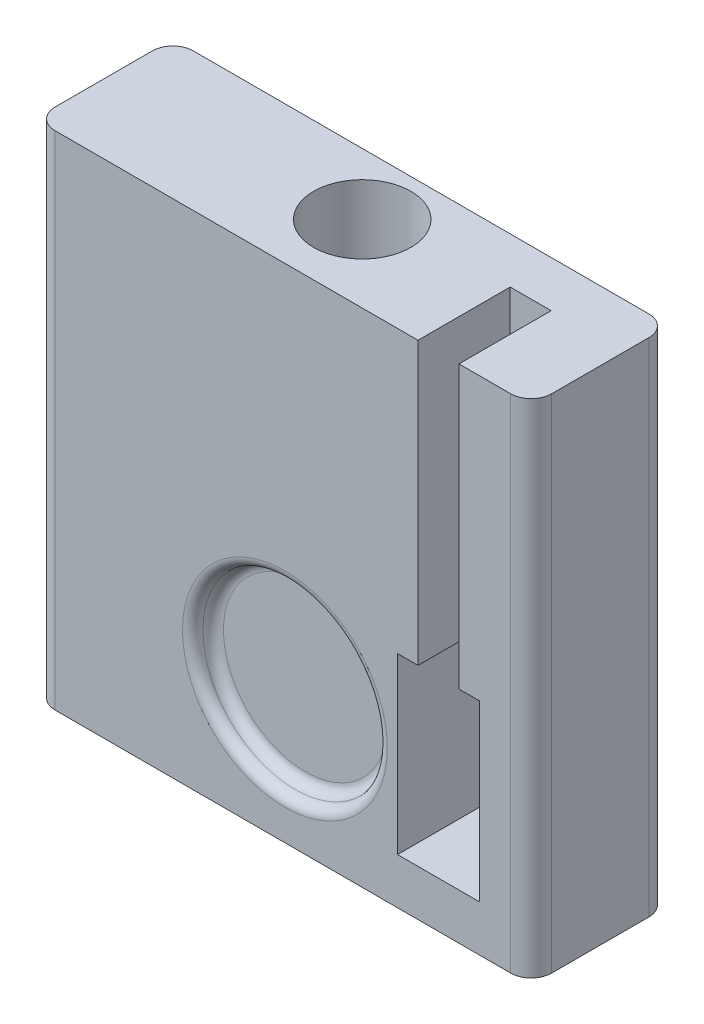
ISO-10303-21;
HEADER;
FILE_DESCRIPTION(('STEP AP214'),'2;1');
FILE_NAME('part.step','',(''),(''),'','','');
FILE_SCHEMA(('AUTOMOTIVE_DESIGN { 1 0 10303 214 1 1 1 1 }'));
ENDSEC;
DATA;
#1=APPLICATION_CONTEXT('core data for automotive mechanical design processes');
#2=APPLICATION_PROTOCOL_DEFINITION('international standard','automotive_design',2000,#1);
#3=PRODUCT_CONTEXT('',#1,'mechanical');
#4=PRODUCT('Part','Part','',(#3));
#5=PRODUCT_RELATED_PRODUCT_CATEGORY('part','',(#4));
#6=PRODUCT_DEFINITION_FORMATION('','',#4);
#7=PRODUCT_DEFINITION_CONTEXT('part definition',#1,'design');
#8=PRODUCT_DEFINITION('design','',#6,#7);
#9=PRODUCT_DEFINITION_SHAPE('','',#8);
#10=(LENGTH_UNIT() NAMED_UNIT(*) SI_UNIT(.MILLI.,.METRE.));
#11=(NAMED_UNIT(*) PLANE_ANGLE_UNIT() SI_UNIT($,.RADIAN.));
#12=(NAMED_UNIT(*) SI_UNIT($,.STERADIAN.) SOLID_ANGLE_UNIT());
#13=UNCERTAINTY_MEASURE_WITH_UNIT(LENGTH_MEASURE(1.E-05),#10,'distance_accuracy_value','');
#14=(GEOMETRIC_REPRESENTATION_CONTEXT(3) GLOBAL_UNCERTAINTY_ASSIGNED_CONTEXT((#13)) GLOBAL_UNIT_ASSIGNED_CONTEXT((#10,
#11,#12)) REPRESENTATION_CONTEXT('',''));
#15=CARTESIAN_POINT('',(0.,0.,0.));
#16=DIRECTION('',(0.,0.,1.));
#17=DIRECTION('',(1.,0.,0.));
#18=AXIS2_PLACEMENT_3D('',#15,#16,#17);
#19=CARTESIAN_POINT('',(0.,0.,-26.8410191337075));
#20=DIRECTION('',(0.,0.,1.));
#21=DIRECTION('',(1.,0.,0.));
#22=AXIS2_PLACEMENT_3D('',#19,#20,#21);
#23=PLANE('',#22);
#24=DIRECTION('',(-1.,0.,0.));
#25=VECTOR('',#24,1.);
#26=CARTESIAN_POINT('',(32.6433043612604,2.51671301439862,-26.8410191337075));
#27=LINE('',#26,#25);
#28=CARTESIAN_POINT('',(40.6433043612604,2.51671301439862,-26.8410191337075));
#29=VERTEX_POINT('',#28);
#30=CARTESIAN_POINT('',(32.6433043612604,2.51671301439862,-26.8410191337075));
#31=VERTEX_POINT('',#30);
#32=EDGE_CURVE('E200',#29,#31,#27,.T.);
#33=ORIENTED_EDGE('',*,*,#32,.T.);
#34=DIRECTION('',(0.,-1.,0.));
#35=VECTOR('',#34,1.);
#36=CARTESIAN_POINT('',(32.6433043612604,2.51671301439862,-26.8410191337075));
#37=LINE('',#36,#35);
#38=CARTESIAN_POINT('',(32.6433043612604,-14.4832869856014,-26.8410191337075));
#39=VERTEX_POINT('',#38);
#40=EDGE_CURVE('E190',#31,#39,#37,.T.);
#41=ORIENTED_EDGE('',*,*,#40,.T.);
#42=DIRECTION('',(1.,0.,0.));
#43=VECTOR('',#42,1.);
#44=CARTESIAN_POINT('',(32.6433043612604,-14.4832869856014,-26.8410191337075));
#45=LINE('',#44,#43);
#46=CARTESIAN_POINT('',(40.6433043612604,-14.4832869856014,-26.8410191337075));
#47=VERTEX_POINT('',#46);
#48=EDGE_CURVE('E193',#39,#47,#45,.T.);
#49=ORIENTED_EDGE('',*,*,#48,.T.);
#50=DIRECTION('',(0.,1.,0.));
#51=VECTOR('',#50,1.);
#52=CARTESIAN_POINT('',(40.6433043612604,2.51671301439862,-26.8410191337075));
#53=LINE('',#52,#51);
#54=EDGE_CURVE('E197',#47,#29,#53,.T.);
#55=ORIENTED_EDGE('',*,*,#54,.T.);
#56=EDGE_LOOP('',(#33,#41,#49,#55));
#57=FACE_BOUND('',#56,.T.);
#58=ADVANCED_FACE('F36',(#57),#23,.T.);
#59=CARTESIAN_POINT('',(43.696678655462,-69.3290720526958,-16.8410191337075));
#60=DIRECTION('',(0.,0.,-1.));
#61=DIRECTION('',(-1.,0.,0.));
#62=AXIS2_PLACEMENT_3D('',#59,#60,#61);
#63=PLANE('',#62);
#64=CARTESIAN_POINT('',(21.6433043612604,-5.98328698560138,-16.8410191337075));
#65=DIRECTION('',(0.,0.,-1.));
#66=DIRECTION('',(-1.,0.,0.));
#67=AXIS2_PLACEMENT_3D('',#64,#65,#66);
#68=CIRCLE('',#67,10.);
#69=CARTESIAN_POINT('',(11.6433043612604,-5.98328698560138,-16.8410191337075));
#70=VERTEX_POINT('',#69);
#71=EDGE_CURVE('E45',#70,#70,#68,.T.);
#72=ORIENTED_EDGE('',*,*,#71,.T.);
#73=EDGE_LOOP('',(#72));
#74=FACE_BOUND('',#73,.T.);
#75=DIRECTION('',(0.,1.,0.));
#76=VECTOR('',#75,1.);
#77=CARTESIAN_POINT('',(38.6433043612604,-7.98525416012828,-16.8410191337075));
#78=LINE('',#77,#76);
#79=CARTESIAN_POINT('',(38.6433043612604,2.51671301439862,-16.8410191337075));
#80=VERTEX_POINT('',#79);
#81=CARTESIAN_POINT('',(38.6433043612604,30.0147458398717,-16.8410191337075));
#82=VERTEX_POINT('',#81);
#83=EDGE_CURVE('E173',#80,#82,#78,.T.);
#84=ORIENTED_EDGE('',*,*,#83,.F.);
#85=DIRECTION('',(-1.,0.,0.));
#86=VECTOR('',#85,1.);
#87=CARTESIAN_POINT('',(32.6433043612604,2.51671301439862,-16.8410191337075));
#88=LINE('',#87,#86);
#89=CARTESIAN_POINT('',(40.6433043612604,2.51671301439862,-16.8410191337075));
#90=VERTEX_POINT('',#89);
#91=EDGE_CURVE('E194',#90,#80,#88,.T.);
#92=ORIENTED_EDGE('',*,*,#91,.F.);
#93=DIRECTION('',(0.,1.,0.));
#94=VECTOR('',#93,1.);
#95=CARTESIAN_POINT('',(40.6433043612604,2.51671301439862,-16.8410191337075));
#96=LINE('',#95,#94);
#97=CARTESIAN_POINT('',(40.6433043612604,-14.4832869856014,-16.8410191337075));
#98=VERTEX_POINT('',#97);
#99=EDGE_CURVE('E207',#98,#90,#96,.T.);
#100=ORIENTED_EDGE('',*,*,#99,.F.);
#101=DIRECTION('',(1.,0.,0.));
#102=VECTOR('',#101,1.);
#103=CARTESIAN_POINT('',(32.6433043612604,-14.4832869856014,-16.8410191337075));
#104=LINE('',#103,#102);
#105=CARTESIAN_POINT('',(32.6433043612604,-14.4832869856014,-16.8410191337075));
#106=VERTEX_POINT('',#105);
#107=EDGE_CURVE('E204',#106,#98,#104,.T.);
#108=ORIENTED_EDGE('',*,*,#107,.F.);
#109=DIRECTION('',(0.,-1.,0.));
#110=VECTOR('',#109,1.);
#111=CARTESIAN_POINT('',(32.6433043612604,2.51671301439862,-16.8410191337075));
#112=LINE('',#111,#110);
#113=CARTESIAN_POINT('',(32.6433043612604,2.51671301439862,-16.8410191337075));
#114=VERTEX_POINT('',#113);
#115=EDGE_CURVE('E60',#114,#106,#112,.T.);
#116=ORIENTED_EDGE('',*,*,#115,.F.);
#117=CARTESIAN_POINT('',(34.6433043612604,2.51671301439862,-16.8410191337075));
#118=VERTEX_POINT('',#117);
#119=EDGE_CURVE('E210',#118,#114,#88,.T.);
#120=ORIENTED_EDGE('',*,*,#119,.F.);
#121=DIRECTION('',(0.,1.,0.));
#122=VECTOR('',#121,1.);
#123=CARTESIAN_POINT('',(34.6433043612604,-7.98525416012828,-16.8410191337075));
#124=LINE('',#123,#122);
#125=CARTESIAN_POINT('',(34.6433043612604,30.0147458398717,-16.8410191337075));
#126=VERTEX_POINT('',#125);
#127=EDGE_CURVE('E170',#118,#126,#124,.T.);
#128=ORIENTED_EDGE('',*,*,#127,.T.);
#129=DIRECTION('',(-1.,0.,0.));
#130=VECTOR('',#129,1.);
#131=CARTESIAN_POINT('',(43.696678655462,30.0147458398717,-16.8410191337075));
#132=LINE('',#131,#130);
#133=CARTESIAN_POINT('',(-0.803321344537979,30.0147458398717,-16.8410191337075));
#134=VERTEX_POINT('',#133);
#135=EDGE_CURVE('E169',#126,#134,#132,.T.);
#136=ORIENTED_EDGE('',*,*,#135,.T.);
#137=DIRECTION('',(0.,1.,0.));
#138=VECTOR('',#137,1.);
#139=CARTESIAN_POINT('',(-0.803321344537979,-69.3290720526958,-16.8410191337075));
#140=LINE('',#139,#138);
#141=CARTESIAN_POINT('',(-0.803321344537979,-18.9852541601283,-16.8410191337075));
#142=VERTEX_POINT('',#141);
#143=EDGE_CURVE('E245',#142,#134,#140,.T.);
#144=ORIENTED_EDGE('',*,*,#143,.F.);
#145=DIRECTION('',(-1.,0.,0.));
#146=VECTOR('',#145,1.);
#147=CARTESIAN_POINT('',(43.696678655462,-18.9852541601283,-16.8410191337075));
#148=LINE('',#147,#146);
#149=CARTESIAN_POINT('',(43.696678655462,-18.9852541601283,-16.8410191337075));
#150=VERTEX_POINT('',#149);
#151=EDGE_CURVE('E268',#150,#142,#148,.T.);
#152=ORIENTED_EDGE('',*,*,#151,.F.);
#153=DIRECTION('',(0.,1.,0.));
#154=VECTOR('',#153,1.);
#155=CARTESIAN_POINT('',(43.696678655462,-69.3290720526958,-16.8410191337075));
#156=LINE('',#155,#154);
#157=CARTESIAN_POINT('',(43.696678655462,30.0147458398717,-16.8410191337075));
#158=VERTEX_POINT('',#157);
#159=EDGE_CURVE('E252',#150,#158,#156,.T.);
#160=ORIENTED_EDGE('',*,*,#159,.T.);
#161=EDGE_CURVE('E246',#158,#82,#132,.T.);
#162=ORIENTED_EDGE('',*,*,#161,.T.);
#163=EDGE_LOOP('',(#84,#92,#100,#108,#116,#120,#128,#136,#144,#152,#160,#162));
#164=FACE_BOUND('',#163,.T.);
#165=ADVANCED_FACE('F288',(#74,#164),#63,.F.);
#166=CARTESIAN_POINT('',(43.696678655462,30.0147458398717,-18.8410191337075));
#167=DIRECTION('',(0.,-1.,0.));
#168=DIRECTION('',(0.,0.,-1.));
#169=AXIS2_PLACEMENT_3D('',#166,#167,#168);
#170=PLANE('',#169);
#171=DIRECTION('',(1.,0.,0.));
#172=VECTOR('',#171,1.);
#173=CARTESIAN_POINT('',(34.6433043612604,30.0147458398717,-25.8410191337075));
#174=LINE('',#173,#172);
#175=CARTESIAN_POINT('',(34.6433043612604,30.0147458398717,-25.8410191337075));
#176=VERTEX_POINT('',#175);
#177=CARTESIAN_POINT('',(38.6433043612604,30.0147458398717,-25.8410191337075));
#178=VERTEX_POINT('',#177);
#179=EDGE_CURVE('E149',#176,#178,#174,.T.);
#180=ORIENTED_EDGE('',*,*,#179,.T.);
#181=DIRECTION('',(0.,0.,1.));
#182=VECTOR('',#181,1.);
#183=CARTESIAN_POINT('',(38.6433043612604,30.0147458398717,0.));
#184=LINE('',#183,#182);
#185=EDGE_CURVE('E171',#178,#82,#184,.T.);
#186=ORIENTED_EDGE('',*,*,#185,.T.);
#187=ORIENTED_EDGE('',*,*,#161,.F.);
#188=CARTESIAN_POINT('',(43.696678655462,30.0147458398717,-18.8410191337075));
#189=DIRECTION('',(0.,-1.,0.));
#190=DIRECTION('',(0.,0.,-1.));
#191=AXIS2_PLACEMENT_3D('',#188,#189,#190);
#192=CIRCLE('',#191,2.);
#193=CARTESIAN_POINT('',(45.696678655462,30.0147458398717,-18.8410191337075));
#194=VERTEX_POINT('',#193);
#195=EDGE_CURVE('E249',#194,#158,#192,.T.);
#196=ORIENTED_EDGE('',*,*,#195,.F.);
#197=DIRECTION('',(0.,0.,1.));
#198=VECTOR('',#197,1.);
#199=CARTESIAN_POINT('',(45.696678655462,30.0147458398717,-28.3410191337075));
#200=LINE('',#199,#198);
#201=CARTESIAN_POINT('',(45.696678655462,30.0147458398717,-28.3410191337075));
#202=VERTEX_POINT('',#201);
#203=EDGE_CURVE('E221',#202,#194,#200,.T.);
#204=ORIENTED_EDGE('',*,*,#203,.F.);
#205=CARTESIAN_POINT('',(43.696678655462,30.0147458398717,-28.3410191337075));
#206=DIRECTION('',(0.,-1.,0.));
#207=DIRECTION('',(0.,0.,-1.));
#208=AXIS2_PLACEMENT_3D('',#205,#206,#207);
#209=CIRCLE('',#208,2.);
#210=CARTESIAN_POINT('',(43.696678655462,30.0147458398717,-30.3410191337075));
#211=VERTEX_POINT('',#210);
#212=EDGE_CURVE('E226',#211,#202,#209,.T.);
#213=ORIENTED_EDGE('',*,*,#212,.F.);
#214=DIRECTION('',(1.,0.,0.));
#215=VECTOR('',#214,1.);
#216=CARTESIAN_POINT('',(-0.803321344537978,30.0147458398717,-30.3410191337075));
#217=LINE('',#216,#215);
#218=CARTESIAN_POINT('',(-0.803321344537978,30.0147458398717,-30.3410191337075));
#219=VERTEX_POINT('',#218);
#220=EDGE_CURVE('E230',#219,#211,#217,.T.);
#221=ORIENTED_EDGE('',*,*,#220,.F.);
#222=CARTESIAN_POINT('',(-0.803321344537978,30.0147458398717,-28.3410191337075));
#223=DIRECTION('',(0.,-1.,0.));
#224=DIRECTION('',(0.,0.,-1.));
#225=AXIS2_PLACEMENT_3D('',#222,#223,#224);
#226=CIRCLE('',#225,2.);
#227=CARTESIAN_POINT('',(-2.80332134453798,30.0147458398717,-28.3410191337075));
#228=VERTEX_POINT('',#227);
#229=EDGE_CURVE('E234',#228,#219,#226,.T.);
#230=ORIENTED_EDGE('',*,*,#229,.F.);
#231=DIRECTION('',(0.,0.,-1.));
#232=VECTOR('',#231,1.);
#233=CARTESIAN_POINT('',(-2.80332134453798,30.0147458398717,-18.8410191337075));
#234=LINE('',#233,#232);
#235=CARTESIAN_POINT('',(-2.80332134453798,30.0147458398717,-18.8410191337075));
#236=VERTEX_POINT('',#235);
#237=EDGE_CURVE('E238',#236,#228,#234,.T.);
#238=ORIENTED_EDGE('',*,*,#237,.F.);
#239=CARTESIAN_POINT('',(-0.803321344537979,30.0147458398717,-18.8410191337075));
#240=DIRECTION('',(0.,-1.,0.));
#241=DIRECTION('',(0.,0.,-1.));
#242=AXIS2_PLACEMENT_3D('',#239,#240,#241);
#243=CIRCLE('',#242,2.);
#244=EDGE_CURVE('E242',#134,#236,#243,.T.);
#245=ORIENTED_EDGE('',*,*,#244,.F.);
#246=ORIENTED_EDGE('',*,*,#135,.F.);
#247=DIRECTION('',(0.,0.,1.));
#248=VECTOR('',#247,1.);
#249=CARTESIAN_POINT('',(34.6433043612604,30.0147458398717,0.));
#250=LINE('',#249,#248);
#251=EDGE_CURVE('E161',#176,#126,#250,.T.);
#252=ORIENTED_EDGE('',*,*,#251,.F.);
#253=EDGE_LOOP('',(#180,#186,#187,#196,#204,#213,#221,#230,#238,#245,#246,#252));
#254=FACE_BOUND('',#253,.T.);
#255=CARTESIAN_POINT('',(21.696678655462,30.0147458398717,-24.3410191337075));
#256=DIRECTION('',(0.,1.,0.));
#257=DIRECTION('',(0.,0.,1.));
#258=AXIS2_PLACEMENT_3D('',#255,#256,#257);
#259=CIRCLE('',#258,4.75);
#260=CARTESIAN_POINT('',(21.696678655462,30.0147458398717,-19.5910191337075));
#261=VERTEX_POINT('',#260);
#262=EDGE_CURVE('E184',#261,#261,#259,.T.);
#263=ORIENTED_EDGE('',*,*,#262,.F.);
#264=EDGE_LOOP('',(#263));
#265=FACE_BOUND('',#264,.T.);
#266=ADVANCED_FACE('F166',(#254,#265),#170,.F.);
#267=CARTESIAN_POINT('',(43.696678655462,-69.3290720526958,-18.8410191337075));
#268=DIRECTION('',(0.,1.,0.));
#269=DIRECTION('',(0.,0.,1.));
#270=AXIS2_PLACEMENT_3D('',#267,#268,#269);
#271=CYLINDRICAL_SURFACE('',#270,2.);
#272=CARTESIAN_POINT('',(43.696678655462,-18.9852541601283,-18.8410191337075));
#273=DIRECTION('',(0.,-1.,0.));
#274=DIRECTION('',(0.,0.,-1.));
#275=AXIS2_PLACEMENT_3D('',#272,#273,#274);
#276=CIRCLE('',#275,2.);
#277=CARTESIAN_POINT('',(45.696678655462,-18.9852541601283,-18.8410191337075));
#278=VERTEX_POINT('',#277);
#279=EDGE_CURVE('E271',#278,#150,#276,.T.);
#280=ORIENTED_EDGE('',*,*,#279,.F.);
#281=DIRECTION('',(0.,1.,0.));
#282=VECTOR('',#281,1.);
#283=CARTESIAN_POINT('',(45.696678655462,-69.3290720526958,-18.8410191337075));
#284=LINE('',#283,#282);
#285=EDGE_CURVE('E215',#278,#194,#284,.T.);
#286=ORIENTED_EDGE('',*,*,#285,.T.);
#287=ORIENTED_EDGE('',*,*,#195,.T.);
#288=ORIENTED_EDGE('',*,*,#159,.F.);
#289=EDGE_LOOP('',(#280,#286,#287,#288));
#290=FACE_BOUND('',#289,.T.);
#291=ADVANCED_FACE('F334',(#290),#271,.T.);
#292=CARTESIAN_POINT('',(-0.803321344537979,-69.3290720526958,-18.8410191337075));
#293=DIRECTION('',(0.,1.,0.));
#294=DIRECTION('',(0.,0.,1.));
#295=AXIS2_PLACEMENT_3D('',#292,#293,#294);
#296=CYLINDRICAL_SURFACE('',#295,2.);
#297=CARTESIAN_POINT('',(-0.803321344537979,-18.9852541601283,-18.8410191337075));
#298=DIRECTION('',(0.,-1.,0.));
#299=DIRECTION('',(0.,0.,-1.));
#300=AXIS2_PLACEMENT_3D('',#297,#298,#299);
#301=CIRCLE('',#300,2.);
#302=CARTESIAN_POINT('',(-2.80332134453798,-18.9852541601283,-18.8410191337075));
#303=VERTEX_POINT('',#302);
#304=EDGE_CURVE('E265',#142,#303,#301,.T.);
#305=ORIENTED_EDGE('',*,*,#304,.F.);
#306=ORIENTED_EDGE('',*,*,#143,.T.);
#307=ORIENTED_EDGE('',*,*,#244,.T.);
#308=DIRECTION('',(0.,1.,0.));
#309=VECTOR('',#308,1.);
#310=CARTESIAN_POINT('',(-2.80332134453798,-69.3290720526958,-18.8410191337075));
#311=LINE('',#310,#309);
#312=EDGE_CURVE('E241',#303,#236,#311,.T.);
#313=ORIENTED_EDGE('',*,*,#312,.F.);
#314=EDGE_LOOP('',(#305,#306,#307,#313));
#315=FACE_BOUND('',#314,.T.);
#316=ADVANCED_FACE('F354',(#315),#296,.T.);
#317=CARTESIAN_POINT('',(-2.80332134453798,-69.3290720526958,-18.8410191337075));
#318=DIRECTION('',(1.,0.,0.));
#319=DIRECTION('',(0.,0.,-1.));
#320=AXIS2_PLACEMENT_3D('',#317,#318,#319);
#321=PLANE('',#320);
#322=DIRECTION('',(0.,0.,-1.));
#323=VECTOR('',#322,1.);
#324=CARTESIAN_POINT('',(-2.80332134453798,-18.9852541601283,-18.8410191337075));
#325=LINE('',#324,#323);
#326=CARTESIAN_POINT('',(-2.80332134453798,-18.9852541601283,-28.3410191337075));
#327=VERTEX_POINT('',#326);
#328=EDGE_CURVE('E262',#303,#327,#325,.T.);
#329=ORIENTED_EDGE('',*,*,#328,.F.);
#330=ORIENTED_EDGE('',*,*,#312,.T.);
#331=ORIENTED_EDGE('',*,*,#237,.T.);
#332=DIRECTION('',(0.,1.,0.));
#333=VECTOR('',#332,1.);
#334=CARTESIAN_POINT('',(-2.80332134453798,-69.3290720526958,-28.3410191337075));
#335=LINE('',#334,#333);
#336=EDGE_CURVE('E237',#327,#228,#335,.T.);
#337=ORIENTED_EDGE('',*,*,#336,.F.);
#338=EDGE_LOOP('',(#329,#330,#331,#337));
#339=FACE_BOUND('',#338,.T.);
#340=ADVANCED_FACE('F350',(#339),#321,.F.);
#341=CARTESIAN_POINT('',(-0.803321344537978,-69.3290720526958,-28.3410191337075));
#342=DIRECTION('',(0.,1.,0.));
#343=DIRECTION('',(0.,0.,1.));
#344=AXIS2_PLACEMENT_3D('',#341,#342,#343);
#345=CYLINDRICAL_SURFACE('',#344,2.);
#346=CARTESIAN_POINT('',(-0.803321344537978,-18.9852541601283,-28.3410191337075));
#347=DIRECTION('',(0.,-1.,0.));
#348=DIRECTION('',(0.,0.,-1.));
#349=AXIS2_PLACEMENT_3D('',#346,#347,#348);
#350=CIRCLE('',#349,2.);
#351=CARTESIAN_POINT('',(-0.803321344537978,-18.9852541601283,-30.3410191337075));
#352=VERTEX_POINT('',#351);
#353=EDGE_CURVE('E259',#327,#352,#350,.T.);
#354=ORIENTED_EDGE('',*,*,#353,.F.);
#355=ORIENTED_EDGE('',*,*,#336,.T.);
#356=ORIENTED_EDGE('',*,*,#229,.T.);
#357=DIRECTION('',(0.,1.,0.));
#358=VECTOR('',#357,1.);
#359=CARTESIAN_POINT('',(-0.803321344537978,-69.3290720526958,-30.3410191337075));
#360=LINE('',#359,#358);
#361=EDGE_CURVE('E233',#352,#219,#360,.T.);
#362=ORIENTED_EDGE('',*,*,#361,.F.);
#363=EDGE_LOOP('',(#354,#355,#356,#362));
#364=FACE_BOUND('',#363,.T.);
#365=ADVANCED_FACE('F346',(#364),#345,.T.);
#366=CARTESIAN_POINT('',(-0.803321344537978,-69.3290720526958,-30.3410191337075));
#367=DIRECTION('',(0.,0.,1.));
#368=DIRECTION('',(1.,0.,0.));
#369=AXIS2_PLACEMENT_3D('',#366,#367,#368);
#370=PLANE('',#369);
#371=DIRECTION('',(1.,0.,0.));
#372=VECTOR('',#371,1.);
#373=CARTESIAN_POINT('',(-0.803321344537978,-18.9852541601283,-30.3410191337075));
#374=LINE('',#373,#372);
#375=CARTESIAN_POINT('',(43.696678655462,-18.9852541601283,-30.3410191337075));
#376=VERTEX_POINT('',#375);
#377=EDGE_CURVE('E256',#352,#376,#374,.T.);
#378=ORIENTED_EDGE('',*,*,#377,.F.);
#379=ORIENTED_EDGE('',*,*,#361,.T.);
#380=ORIENTED_EDGE('',*,*,#220,.T.);
#381=DIRECTION('',(0.,1.,0.));
#382=VECTOR('',#381,1.);
#383=CARTESIAN_POINT('',(43.696678655462,-69.3290720526958,-30.3410191337075));
#384=LINE('',#383,#382);
#385=EDGE_CURVE('E229',#376,#211,#384,.T.);
#386=ORIENTED_EDGE('',*,*,#385,.F.);
#387=EDGE_LOOP('',(#378,#379,#380,#386));
#388=FACE_BOUND('',#387,.T.);
#389=ADVANCED_FACE('F342',(#388),#370,.F.);
#390=CARTESIAN_POINT('',(43.696678655462,-69.3290720526958,-28.3410191337075));
#391=DIRECTION('',(0.,1.,0.));
#392=DIRECTION('',(0.,0.,1.));
#393=AXIS2_PLACEMENT_3D('',#390,#391,#392);
#394=CYLINDRICAL_SURFACE('',#393,2.);
#395=CARTESIAN_POINT('',(43.696678655462,-18.9852541601283,-28.3410191337075));
#396=DIRECTION('',(0.,-1.,0.));
#397=DIRECTION('',(0.,0.,-1.));
#398=AXIS2_PLACEMENT_3D('',#395,#396,#397);
#399=CIRCLE('',#398,2.);
#400=CARTESIAN_POINT('',(45.696678655462,-18.9852541601283,-28.3410191337075));
#401=VERTEX_POINT('',#400);
#402=EDGE_CURVE('E253',#376,#401,#399,.T.);
#403=ORIENTED_EDGE('',*,*,#402,.F.);
#404=ORIENTED_EDGE('',*,*,#385,.T.);
#405=ORIENTED_EDGE('',*,*,#212,.T.);
#406=DIRECTION('',(0.,1.,0.));
#407=VECTOR('',#406,1.);
#408=CARTESIAN_POINT('',(45.696678655462,-69.3290720526958,-28.3410191337075));
#409=LINE('',#408,#407);
#410=EDGE_CURVE('E225',#401,#202,#409,.T.);
#411=ORIENTED_EDGE('',*,*,#410,.F.);
#412=EDGE_LOOP('',(#403,#404,#405,#411));
#413=FACE_BOUND('',#412,.T.);
#414=ADVANCED_FACE('F338',(#413),#394,.T.);
#415=CARTESIAN_POINT('',(45.696678655462,-69.3290720526958,-28.3410191337075));
#416=DIRECTION('',(-1.,0.,0.));
#417=DIRECTION('',(0.,0.,1.));
#418=AXIS2_PLACEMENT_3D('',#415,#416,#417);
#419=PLANE('',#418);
#420=DIRECTION('',(0.,0.,1.));
#421=VECTOR('',#420,1.);
#422=CARTESIAN_POINT('',(45.696678655462,-18.9852541601283,-28.3410191337075));
#423=LINE('',#422,#421);
#424=EDGE_CURVE('E224',#401,#278,#423,.T.);
#425=ORIENTED_EDGE('',*,*,#424,.F.);
#426=ORIENTED_EDGE('',*,*,#410,.T.);
#427=ORIENTED_EDGE('',*,*,#203,.T.);
#428=ORIENTED_EDGE('',*,*,#285,.F.);
#429=EDGE_LOOP('',(#425,#426,#427,#428));
#430=FACE_BOUND('',#429,.T.);
#431=ADVANCED_FACE('F335',(#430),#419,.F.);
#432=CARTESIAN_POINT('',(46.696678655462,-18.9852541601283,-49.8410191337075));
#433=DIRECTION('',(0.,-1.,0.));
#434=DIRECTION('',(0.,0.,-1.));
#435=AXIS2_PLACEMENT_3D('',#432,#433,#434);
#436=PLANE('',#435);
#437=ORIENTED_EDGE('',*,*,#424,.T.);
#438=ORIENTED_EDGE('',*,*,#279,.T.);
#439=ORIENTED_EDGE('',*,*,#151,.T.);
#440=ORIENTED_EDGE('',*,*,#304,.T.);
#441=ORIENTED_EDGE('',*,*,#328,.T.);
#442=ORIENTED_EDGE('',*,*,#353,.T.);
#443=ORIENTED_EDGE('',*,*,#377,.T.);
#444=ORIENTED_EDGE('',*,*,#402,.T.);
#445=EDGE_LOOP('',(#437,#438,#439,#440,#441,#442,#443,#444));
#446=FACE_BOUND('',#445,.T.);
#447=ADVANCED_FACE('F331',(#446),#436,.T.);
#448=CARTESIAN_POINT('',(32.6433043612604,2.51671301439862,-26.8410191337075));
#449=DIRECTION('',(-1.,0.,0.));
#450=DIRECTION('',(0.,0.,1.));
#451=AXIS2_PLACEMENT_3D('',#448,#449,#450);
#452=PLANE('',#451);
#453=ORIENTED_EDGE('',*,*,#115,.T.);
#454=DIRECTION('',(0.,0.,1.));
#455=VECTOR('',#454,1.);
#456=CARTESIAN_POINT('',(32.6433043612604,-14.4832869856014,-26.8410191337075));
#457=LINE('',#456,#455);
#458=EDGE_CURVE('E202',#39,#106,#457,.T.);
#459=ORIENTED_EDGE('',*,*,#458,.F.);
#460=ORIENTED_EDGE('',*,*,#40,.F.);
#461=DIRECTION('',(0.,0.,1.));
#462=VECTOR('',#461,1.);
#463=CARTESIAN_POINT('',(32.6433043612604,2.51671301439862,-26.8410191337075));
#464=LINE('',#463,#462);
#465=EDGE_CURVE('E213',#31,#114,#464,.T.);
#466=ORIENTED_EDGE('',*,*,#465,.T.);
#467=EDGE_LOOP('',(#453,#459,#460,#466));
#468=FACE_BOUND('',#467,.T.);
#469=ADVANCED_FACE('F321',(#468),#452,.F.);
#470=CARTESIAN_POINT('',(32.6433043612604,2.51671301439862,-26.8410191337075));
#471=DIRECTION('',(0.,1.,0.));
#472=DIRECTION('',(0.,0.,1.));
#473=AXIS2_PLACEMENT_3D('',#470,#471,#472);
#474=PLANE('',#473);
#475=ORIENTED_EDGE('',*,*,#465,.F.);
#476=ORIENTED_EDGE('',*,*,#32,.F.);
#477=DIRECTION('',(0.,0.,1.));
#478=VECTOR('',#477,1.);
#479=CARTESIAN_POINT('',(40.6433043612604,2.51671301439862,-26.8410191337075));
#480=LINE('',#479,#478);
#481=EDGE_CURVE('E216',#29,#90,#480,.T.);
#482=ORIENTED_EDGE('',*,*,#481,.T.);
#483=ORIENTED_EDGE('',*,*,#91,.T.);
#484=DIRECTION('',(0.,0.,1.));
#485=VECTOR('',#484,1.);
#486=CARTESIAN_POINT('',(38.6433043612604,2.51671301439862,-26.8410191337075));
#487=LINE('',#486,#485);
#488=CARTESIAN_POINT('',(38.6433043612604,2.51671301439862,-25.8410191337075));
#489=VERTEX_POINT('',#488);
#490=EDGE_CURVE('E182',#489,#80,#487,.T.);
#491=ORIENTED_EDGE('',*,*,#490,.F.);
#492=DIRECTION('',(-1.,0.,0.));
#493=VECTOR('',#492,1.);
#494=CARTESIAN_POINT('',(34.6433043612604,2.51671301439862,-25.8410191337075));
#495=LINE('',#494,#493);
#496=CARTESIAN_POINT('',(34.6433043612604,2.51671301439862,-25.8410191337075));
#497=VERTEX_POINT('',#496);
#498=EDGE_CURVE('E175',#489,#497,#495,.T.);
#499=ORIENTED_EDGE('',*,*,#498,.T.);
#500=DIRECTION('',(0.,0.,1.));
#501=VECTOR('',#500,1.);
#502=CARTESIAN_POINT('',(34.6433043612604,2.51671301439862,-26.8410191337075));
#503=LINE('',#502,#501);
#504=EDGE_CURVE('E163',#497,#118,#503,.T.);
#505=ORIENTED_EDGE('',*,*,#504,.T.);
#506=ORIENTED_EDGE('',*,*,#119,.T.);
#507=EDGE_LOOP('',(#475,#476,#482,#483,#491,#499,#505,#506));
#508=FACE_BOUND('',#507,.T.);
#509=ADVANCED_FACE('F317',(#508),#474,.F.);
#510=CARTESIAN_POINT('',(40.6433043612604,2.51671301439862,-26.8410191337075));
#511=DIRECTION('',(1.,0.,0.));
#512=DIRECTION('',(0.,0.,-1.));
#513=AXIS2_PLACEMENT_3D('',#510,#511,#512);
#514=PLANE('',#513);
#515=ORIENTED_EDGE('',*,*,#99,.T.);
#516=ORIENTED_EDGE('',*,*,#481,.F.);
#517=ORIENTED_EDGE('',*,*,#54,.F.);
#518=DIRECTION('',(0.,0.,1.));
#519=VECTOR('',#518,1.);
#520=CARTESIAN_POINT('',(40.6433043612604,-14.4832869856014,-26.8410191337075));
#521=LINE('',#520,#519);
#522=EDGE_CURVE('E218',#47,#98,#521,.T.);
#523=ORIENTED_EDGE('',*,*,#522,.T.);
#524=EDGE_LOOP('',(#515,#516,#517,#523));
#525=FACE_BOUND('',#524,.T.);
#526=ADVANCED_FACE('F320',(#525),#514,.F.);
#527=CARTESIAN_POINT('',(32.6433043612604,-14.4832869856014,-26.8410191337075));
#528=DIRECTION('',(0.,-1.,0.));
#529=DIRECTION('',(0.,0.,-1.));
#530=AXIS2_PLACEMENT_3D('',#527,#528,#529);
#531=PLANE('',#530);
#532=ORIENTED_EDGE('',*,*,#107,.T.);
#533=ORIENTED_EDGE('',*,*,#522,.F.);
#534=ORIENTED_EDGE('',*,*,#48,.F.);
#535=ORIENTED_EDGE('',*,*,#458,.T.);
#536=EDGE_LOOP('',(#532,#533,#534,#535));
#537=FACE_BOUND('',#536,.T.);
#538=ADVANCED_FACE('F304',(#537),#531,.F.);
#539=CARTESIAN_POINT('',(21.6433043612604,-5.98328698560138,-18.8410191337075));
#540=DIRECTION('',(0.,0.,1.));
#541=DIRECTION('',(1.,0.,0.));
#542=AXIS2_PLACEMENT_3D('',#539,#540,#541);
#543=PLANE('',#542);
#544=CARTESIAN_POINT('',(21.6433043612604,-5.98328698560138,-18.8410191337075));
#545=DIRECTION('',(0.,0.,1.));
#546=DIRECTION('',(1.,0.,0.));
#547=AXIS2_PLACEMENT_3D('',#544,#545,#546);
#548=CIRCLE('',#547,8.);
#549=CARTESIAN_POINT('',(29.6433043612604,-5.98328698560138,-18.8410191337075));
#550=VERTEX_POINT('',#549);
#551=EDGE_CURVE('E11',#550,#550,#548,.T.);
#552=ORIENTED_EDGE('',*,*,#551,.T.);
#553=EDGE_LOOP('',(#552));
#554=FACE_BOUND('',#553,.T.);
#555=ADVANCED_FACE('F299',(#554),#543,.T.);
#556=CARTESIAN_POINT('',(21.6433043612604,-5.98328698560138,-17.8410191337075));
#557=DIRECTION('',(0.,0.,1.));
#558=DIRECTION('',(1.,0.,0.));
#559=AXIS2_PLACEMENT_3D('',#556,#557,#558);
#560=TOROIDAL_SURFACE('',#559,8.,1.);
#561=ORIENTED_EDGE('',*,*,#551,.F.);
#562=EDGE_LOOP('',(#561));
#563=FACE_BOUND('',#562,.T.);
#564=CARTESIAN_POINT('',(21.6433043612604,-5.98328698560138,-17.8410191337075));
#565=DIRECTION('',(0.,0.,1.));
#566=DIRECTION('',(1.,0.,0.));
#567=AXIS2_PLACEMENT_3D('',#564,#565,#566);
#568=CIRCLE('',#567,9.);
#569=CARTESIAN_POINT('',(30.6433043612604,-5.98328698560138,-17.8410191337075));
#570=VERTEX_POINT('',#569);
#571=EDGE_CURVE('E40',#570,#570,#568,.F.);
#572=ORIENTED_EDGE('',*,*,#571,.F.);
#573=EDGE_LOOP('',(#572));
#574=FACE_BOUND('',#573,.T.);
#575=ADVANCED_FACE('F38',(#563,#574),#560,.F.);
#576=CARTESIAN_POINT('',(21.6433043612604,-5.98328698560138,-17.8410191337075));
#577=DIRECTION('',(0.,0.,-1.));
#578=DIRECTION('',(-1.,0.,0.));
#579=AXIS2_PLACEMENT_3D('',#576,#577,#578);
#580=TOROIDAL_SURFACE('',#579,10.,1.);
#581=ORIENTED_EDGE('',*,*,#71,.F.);
#582=EDGE_LOOP('',(#581));
#583=FACE_BOUND('',#582,.T.);
#584=ORIENTED_EDGE('',*,*,#571,.T.);
#585=EDGE_LOOP('',(#584));
#586=FACE_BOUND('',#585,.T.);
#587=ADVANCED_FACE('F291',(#583,#586),#580,.T.);
#588=CARTESIAN_POINT('',(21.696678655462,-9.98525416012828,-24.3410191337075));
#589=DIRECTION('',(0.,1.,0.));
#590=DIRECTION('',(0.,0.,1.));
#591=AXIS2_PLACEMENT_3D('',#588,#589,#590);
#592=CYLINDRICAL_SURFACE('',#591,4.75);
#593=CARTESIAN_POINT('',(21.696678655462,-9.98525416012828,-24.3410191337075));
#594=DIRECTION('',(0.,1.,0.));
#595=DIRECTION('',(0.,0.,1.));
#596=AXIS2_PLACEMENT_3D('',#593,#594,#595);
#597=CIRCLE('',#596,4.75);
#598=CARTESIAN_POINT('',(21.696678655462,-9.98525416012828,-19.5910191337075));
#599=VERTEX_POINT('',#598);
#600=EDGE_CURVE('E185',#599,#599,#597,.T.);
#601=ORIENTED_EDGE('',*,*,#600,.F.);
#602=EDGE_LOOP('',(#601));
#603=FACE_BOUND('',#602,.T.);
#604=ORIENTED_EDGE('',*,*,#262,.T.);
#605=EDGE_LOOP('',(#604));
#606=FACE_BOUND('',#605,.T.);
#607=ADVANCED_FACE('F294',(#603,#606),#592,.F.);
#608=CARTESIAN_POINT('',(21.696678655462,-9.98525416012828,-24.3410191337075));
#609=DIRECTION('',(0.,1.,0.));
#610=DIRECTION('',(0.,0.,1.));
#611=AXIS2_PLACEMENT_3D('',#608,#609,#610);
#612=PLANE('',#611);
#613=ORIENTED_EDGE('',*,*,#600,.T.);
#614=EDGE_LOOP('',(#613));
#615=FACE_BOUND('',#614,.T.);
#616=ADVANCED_FACE('F396',(#615),#612,.T.);
#617=CARTESIAN_POINT('',(38.6433043612604,-7.98525416012828,0.));
#618=DIRECTION('',(-1.,0.,0.));
#619=DIRECTION('',(0.,0.,1.));
#620=AXIS2_PLACEMENT_3D('',#617,#618,#619);
#621=PLANE('',#620);
#622=DIRECTION('',(0.,1.,0.));
#623=VECTOR('',#622,1.);
#624=CARTESIAN_POINT('',(38.6433043612604,-1.60639261121904,-25.8410191337075));
#625=LINE('',#624,#623);
#626=EDGE_CURVE('E152',#489,#178,#625,.T.);
#627=ORIENTED_EDGE('',*,*,#626,.F.);
#628=ORIENTED_EDGE('',*,*,#490,.T.);
#629=ORIENTED_EDGE('',*,*,#83,.T.);
#630=ORIENTED_EDGE('',*,*,#185,.F.);
#631=EDGE_LOOP('',(#627,#628,#629,#630));
#632=FACE_BOUND('',#631,.T.);
#633=ADVANCED_FACE('F375',(#632),#621,.T.);
#634=CARTESIAN_POINT('',(34.6433043612604,-7.98525416012828,0.));
#635=DIRECTION('',(-1.,0.,0.));
#636=DIRECTION('',(0.,0.,1.));
#637=AXIS2_PLACEMENT_3D('',#634,#635,#636);
#638=PLANE('',#637);
#639=ORIENTED_EDGE('',*,*,#504,.F.);
#640=DIRECTION('',(0.,1.,0.));
#641=VECTOR('',#640,1.);
#642=CARTESIAN_POINT('',(34.6433043612604,-1.60639261121904,-25.8410191337075));
#643=LINE('',#642,#641);
#644=EDGE_CURVE('E52',#497,#176,#643,.T.);
#645=ORIENTED_EDGE('',*,*,#644,.T.);
#646=ORIENTED_EDGE('',*,*,#251,.T.);
#647=ORIENTED_EDGE('',*,*,#127,.F.);
#648=EDGE_LOOP('',(#639,#645,#646,#647));
#649=FACE_BOUND('',#648,.T.);
#650=ADVANCED_FACE('F159',(#649),#638,.F.);
#651=CARTESIAN_POINT('',(34.6433043612604,-1.60639261121904,-25.8410191337075));
#652=DIRECTION('',(0.,0.,1.));
#653=DIRECTION('',(1.,0.,0.));
#654=AXIS2_PLACEMENT_3D('',#651,#652,#653);
#655=PLANE('',#654);
#656=ORIENTED_EDGE('',*,*,#498,.F.);
#657=ORIENTED_EDGE('',*,*,#626,.T.);
#658=ORIENTED_EDGE('',*,*,#179,.F.);
#659=ORIENTED_EDGE('',*,*,#644,.F.);
#660=EDGE_LOOP('',(#656,#657,#658,#659));
#661=FACE_BOUND('',#660,.T.);
#662=ADVANCED_FACE('F150',(#661),#655,.T.);
#663=CLOSED_SHELL('',(#58,#165,#266,#291,#316,#340,#365,#389,#414,#431,#447,#469,#509,#526,#538,
#555,#575,#587,#607,#616,#633,#650,#662));
#664=MANIFOLD_SOLID_BREP('B2',#663);
#665=ADVANCED_BREP_SHAPE_REPRESENTATION('',(#18,#664),#14);
#666=SHAPE_DEFINITION_REPRESENTATION(#9,#665);
ENDSEC;
END-ISO-10303-21;
